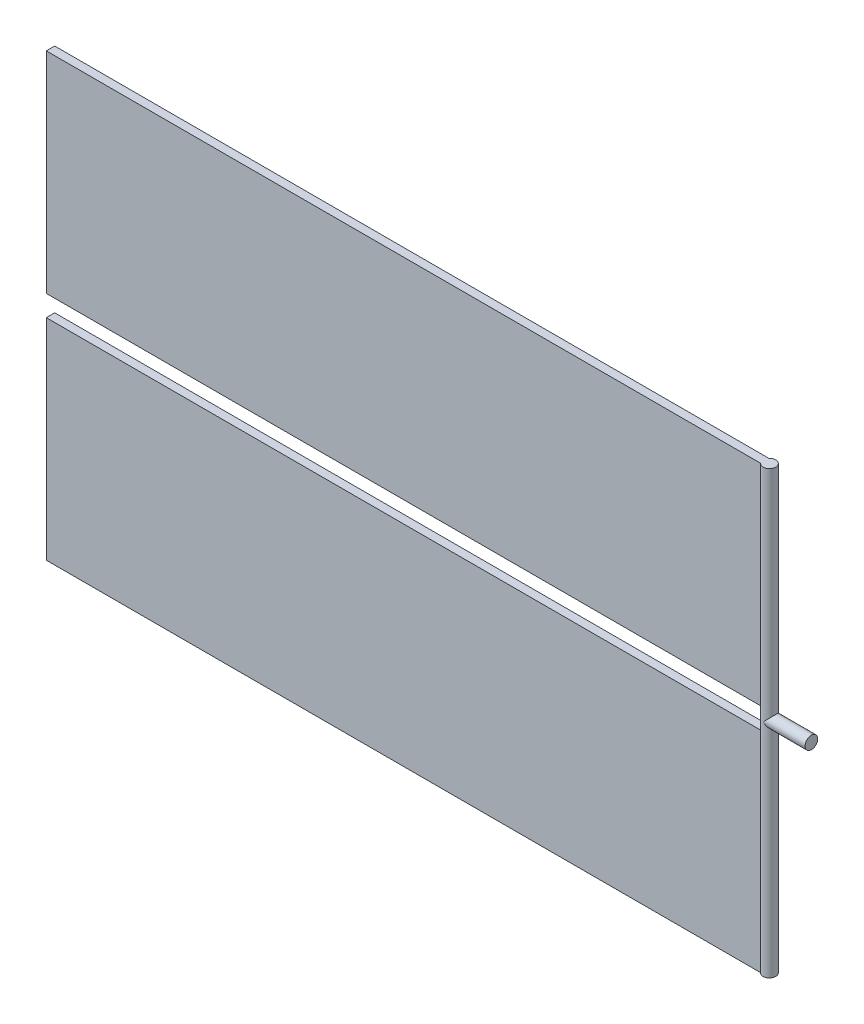
ISO-10303-21;
HEADER;
FILE_DESCRIPTION(('STEP AP214'),'2;1');
FILE_NAME('part.step','',(''),(''),'','','');
FILE_SCHEMA(('AUTOMOTIVE_DESIGN { 1 0 10303 214 1 1 1 1 }'));
ENDSEC;
DATA;
#1=APPLICATION_CONTEXT('core data for automotive mechanical design processes');
#2=APPLICATION_PROTOCOL_DEFINITION('international standard','automotive_design',2000,#1);
#3=PRODUCT_CONTEXT('',#1,'mechanical');
#4=PRODUCT('Part','Part','',(#3));
#5=PRODUCT_RELATED_PRODUCT_CATEGORY('part','',(#4));
#6=PRODUCT_DEFINITION_FORMATION('','',#4);
#7=PRODUCT_DEFINITION_CONTEXT('part definition',#1,'design');
#8=PRODUCT_DEFINITION('design','',#6,#7);
#9=PRODUCT_DEFINITION_SHAPE('','',#8);
#10=(LENGTH_UNIT() NAMED_UNIT(*) SI_UNIT(.MILLI.,.METRE.));
#11=(NAMED_UNIT(*) PLANE_ANGLE_UNIT() SI_UNIT($,.RADIAN.));
#12=(NAMED_UNIT(*) SI_UNIT($,.STERADIAN.) SOLID_ANGLE_UNIT());
#13=UNCERTAINTY_MEASURE_WITH_UNIT(LENGTH_MEASURE(1.E-05),#10,'distance_accuracy_value','');
#14=(GEOMETRIC_REPRESENTATION_CONTEXT(3) GLOBAL_UNCERTAINTY_ASSIGNED_CONTEXT((#13)) GLOBAL_UNIT_ASSIGNED_CONTEXT((#10,
#11,#12)) REPRESENTATION_CONTEXT('',''));
#15=CARTESIAN_POINT('',(0.,0.,0.));
#16=DIRECTION('',(0.,0.,1.));
#17=DIRECTION('',(1.,0.,0.));
#18=AXIS2_PLACEMENT_3D('',#15,#16,#17);
#19=CARTESIAN_POINT('',(111.80339887499,-5250.,0.));
#20=DIRECTION('',(0.,1.,0.));
#21=DIRECTION('',(0.,0.,1.));
#22=AXIS2_PLACEMENT_3D('',#19,#20,#21);
#23=CYLINDRICAL_SURFACE('',#22,150.);
#24=CARTESIAN_POINT('',(111.80339887499,0.,0.));
#25=DIRECTION('',(-0.707106781186547,0.707106781186547,0.));
#26=DIRECTION('',(0.707106781186547,0.707106781186547,0.));
#27=AXIS2_PLACEMENT_3D('',#24,#25,#26);
#28=ELLIPSE('',#27,212.132034355964,150.);
#29=CARTESIAN_POINT('',(111.80339887499,0.,150.));
#30=VERTEX_POINT('',#29);
#31=CARTESIAN_POINT('',(111.80339887499,0.,-150.));
#32=VERTEX_POINT('',#31);
#33=EDGE_CURVE('E11',#30,#32,#28,.T.);
#34=ORIENTED_EDGE('',*,*,#33,.T.);
#35=CARTESIAN_POINT('',(111.80339887499,0.,0.));
#36=DIRECTION('',(0.707106781186547,0.707106781186547,0.));
#37=DIRECTION('',(-0.707106781186547,0.707106781186547,0.));
#38=AXIS2_PLACEMENT_3D('',#35,#36,#37);
#39=ELLIPSE('',#38,212.132034355964,150.);
#40=EDGE_CURVE('E44',#32,#30,#39,.F.);
#41=ORIENTED_EDGE('',*,*,#40,.T.);
#42=EDGE_LOOP('',(#34,#41));
#43=FACE_BOUND('',#42,.T.);
#44=DIRECTION('',(0.,1.,0.));
#45=VECTOR('',#44,1.);
#46=CARTESIAN_POINT('',(7.31890940150233E-13,-5250.,-100.));
#47=LINE('',#46,#45);
#48=CARTESIAN_POINT('',(7.31890940150233E-13,-5250.,-100.));
#49=VERTEX_POINT('',#48);
#50=CARTESIAN_POINT('',(7.31890940150233E-13,-249.999999999997,-100.));
#51=VERTEX_POINT('',#50);
#52=EDGE_CURVE('E111',#49,#51,#47,.T.);
#53=ORIENTED_EDGE('',*,*,#52,.T.);
#54=CARTESIAN_POINT('',(7.31890940150233E-13,249.999999999998,-100.));
#55=VERTEX_POINT('',#54);
#56=EDGE_CURVE('E56',#51,#55,#47,.T.);
#57=ORIENTED_EDGE('',*,*,#56,.T.);
#58=DIRECTION('',(0.,1.,0.));
#59=VECTOR('',#58,1.);
#60=CARTESIAN_POINT('',(7.31890940150233E-13,250.,-100.));
#61=LINE('',#60,#59);
#62=CARTESIAN_POINT('',(7.31890940150233E-13,5250.,-100.));
#63=VERTEX_POINT('',#62);
#64=EDGE_CURVE('E168',#55,#63,#61,.T.);
#65=ORIENTED_EDGE('',*,*,#64,.T.);
#66=CARTESIAN_POINT('',(111.80339887499,5250.,0.));
#67=DIRECTION('',(0.,1.,0.));
#68=DIRECTION('',(0.,0.,1.));
#69=AXIS2_PLACEMENT_3D('',#66,#67,#68);
#70=CIRCLE('',#69,150.);
#71=CARTESIAN_POINT('',(7.31890940150233E-13,5250.,100.));
#72=VERTEX_POINT('',#71);
#73=EDGE_CURVE('E149',#72,#63,#70,.T.);
#74=ORIENTED_EDGE('',*,*,#73,.F.);
#75=DIRECTION('',(0.,1.,0.));
#76=VECTOR('',#75,1.);
#77=CARTESIAN_POINT('',(7.31890940150233E-13,250.,100.));
#78=LINE('',#77,#76);
#79=CARTESIAN_POINT('',(7.31890940150233E-13,249.999999999998,100.));
#80=VERTEX_POINT('',#79);
#81=EDGE_CURVE('E155',#80,#72,#78,.T.);
#82=ORIENTED_EDGE('',*,*,#81,.F.);
#83=DIRECTION('',(0.,1.,0.));
#84=VECTOR('',#83,1.);
#85=CARTESIAN_POINT('',(7.31890940150233E-13,-5250.,100.));
#86=LINE('',#85,#84);
#87=CARTESIAN_POINT('',(7.31890940150233E-13,-249.999999999997,100.));
#88=VERTEX_POINT('',#87);
#89=EDGE_CURVE('E119',#88,#80,#86,.T.);
#90=ORIENTED_EDGE('',*,*,#89,.F.);
#91=CARTESIAN_POINT('',(7.31890940150233E-13,-5250.,100.));
#92=VERTEX_POINT('',#91);
#93=EDGE_CURVE('E154',#92,#88,#86,.T.);
#94=ORIENTED_EDGE('',*,*,#93,.F.);
#95=CARTESIAN_POINT('',(111.80339887499,-5250.,0.));
#96=DIRECTION('',(0.,1.,0.));
#97=DIRECTION('',(0.,0.,1.));
#98=AXIS2_PLACEMENT_3D('',#95,#96,#97);
#99=CIRCLE('',#98,150.);
#100=EDGE_CURVE('E114',#92,#49,#99,.T.);
#101=ORIENTED_EDGE('',*,*,#100,.T.);
#102=EDGE_LOOP('',(#53,#57,#65,#74,#82,#90,#94,#101));
#103=FACE_BOUND('',#102,.T.);
#104=ADVANCED_FACE('F36',(#43,#103),#23,.T.);
#105=CARTESIAN_POINT('',(7.31890940150233E-13,250.,-100.));
#106=DIRECTION('',(0.,-1.,0.));
#107=DIRECTION('',(1.,0.,0.));
#108=AXIS2_PLACEMENT_3D('',#105,#106,#107);
#109=PLANE('',#108);
#110=DIRECTION('',(0.,0.,1.));
#111=VECTOR('',#110,1.);
#112=CARTESIAN_POINT('',(7.31890940150233E-13,250.,-100.));
#113=LINE('',#112,#111);
#114=EDGE_CURVE('E105',#55,#80,#113,.T.);
#115=ORIENTED_EDGE('',*,*,#114,.T.);
#116=DIRECTION('',(1.,0.,0.));
#117=VECTOR('',#116,1.);
#118=CARTESIAN_POINT('',(7.31890940150233E-13,250.,100.));
#119=LINE('',#118,#117);
#120=CARTESIAN_POINT('',(-17000.,249.999999999998,100.));
#121=VERTEX_POINT('',#120);
#122=EDGE_CURVE('E165',#121,#80,#119,.T.);
#123=ORIENTED_EDGE('',*,*,#122,.F.);
#124=DIRECTION('',(0.,0.,1.));
#125=VECTOR('',#124,1.);
#126=CARTESIAN_POINT('',(-17000.,249.999999999998,-100.));
#127=LINE('',#126,#125);
#128=CARTESIAN_POINT('',(-17000.,249.999999999998,-100.));
#129=VERTEX_POINT('',#128);
#130=EDGE_CURVE('E182',#129,#121,#127,.T.);
#131=ORIENTED_EDGE('',*,*,#130,.F.);
#132=DIRECTION('',(1.,0.,0.));
#133=VECTOR('',#132,1.);
#134=CARTESIAN_POINT('',(7.31890940150233E-13,250.,-100.));
#135=LINE('',#134,#133);
#136=EDGE_CURVE('E176',#129,#55,#135,.T.);
#137=ORIENTED_EDGE('',*,*,#136,.T.);
#138=EDGE_LOOP('',(#115,#123,#131,#137));
#139=FACE_BOUND('',#138,.T.);
#140=ADVANCED_FACE('F108',(#139),#109,.T.);
#141=CARTESIAN_POINT('',(-17000.,249.999999999998,-100.));
#142=DIRECTION('',(-1.,0.,0.));
#143=DIRECTION('',(0.,0.,1.));
#144=AXIS2_PLACEMENT_3D('',#141,#142,#143);
#145=PLANE('',#144);
#146=ORIENTED_EDGE('',*,*,#130,.T.);
#147=DIRECTION('',(0.,-1.,0.));
#148=VECTOR('',#147,1.);
#149=CARTESIAN_POINT('',(-17000.,249.999999999998,100.));
#150=LINE('',#149,#148);
#151=CARTESIAN_POINT('',(-17000.,5250.,100.));
#152=VERTEX_POINT('',#151);
#153=EDGE_CURVE('E162',#152,#121,#150,.T.);
#154=ORIENTED_EDGE('',*,*,#153,.F.);
#155=DIRECTION('',(0.,0.,1.));
#156=VECTOR('',#155,1.);
#157=CARTESIAN_POINT('',(-17000.,5250.,-100.));
#158=LINE('',#157,#156);
#159=CARTESIAN_POINT('',(-17000.,5250.,-100.));
#160=VERTEX_POINT('',#159);
#161=EDGE_CURVE('E179',#160,#152,#158,.T.);
#162=ORIENTED_EDGE('',*,*,#161,.F.);
#163=DIRECTION('',(0.,-1.,0.));
#164=VECTOR('',#163,1.);
#165=CARTESIAN_POINT('',(-17000.,249.999999999998,-100.));
#166=LINE('',#165,#164);
#167=EDGE_CURVE('E173',#160,#129,#166,.T.);
#168=ORIENTED_EDGE('',*,*,#167,.T.);
#169=EDGE_LOOP('',(#146,#154,#162,#168));
#170=FACE_BOUND('',#169,.T.);
#171=ADVANCED_FACE('F194',(#170),#145,.T.);
#172=CARTESIAN_POINT('',(7.31890940150233E-13,5250.,-100.));
#173=DIRECTION('',(0.,1.,0.));
#174=DIRECTION('',(-1.,0.,0.));
#175=AXIS2_PLACEMENT_3D('',#172,#173,#174);
#176=PLANE('',#175);
#177=ORIENTED_EDGE('',*,*,#161,.T.);
#178=DIRECTION('',(-1.,0.,0.));
#179=VECTOR('',#178,1.);
#180=CARTESIAN_POINT('',(7.31890940150233E-13,5250.,100.));
#181=LINE('',#180,#179);
#182=EDGE_CURVE('E159',#72,#152,#181,.T.);
#183=ORIENTED_EDGE('',*,*,#182,.F.);
#184=ORIENTED_EDGE('',*,*,#73,.T.);
#185=DIRECTION('',(-1.,0.,0.));
#186=VECTOR('',#185,1.);
#187=CARTESIAN_POINT('',(7.31890940150233E-13,5250.,-100.));
#188=LINE('',#187,#186);
#189=EDGE_CURVE('E170',#63,#160,#188,.T.);
#190=ORIENTED_EDGE('',*,*,#189,.T.);
#191=EDGE_LOOP('',(#177,#183,#184,#190));
#192=FACE_BOUND('',#191,.T.);
#193=ADVANCED_FACE('F38',(#192),#176,.T.);
#194=CARTESIAN_POINT('',(0.,0.,-100.));
#195=DIRECTION('',(0.,0.,1.));
#196=DIRECTION('',(1.,0.,0.));
#197=AXIS2_PLACEMENT_3D('',#194,#195,#196);
#198=PLANE('',#197);
#199=ORIENTED_EDGE('',*,*,#64,.F.);
#200=ORIENTED_EDGE('',*,*,#136,.F.);
#201=ORIENTED_EDGE('',*,*,#167,.F.);
#202=ORIENTED_EDGE('',*,*,#189,.F.);
#203=EDGE_LOOP('',(#199,#200,#201,#202));
#204=FACE_BOUND('',#203,.T.);
#205=ADVANCED_FACE('F200',(#204),#198,.F.);
#206=CARTESIAN_POINT('',(0.,0.,100.));
#207=DIRECTION('',(0.,0.,1.));
#208=DIRECTION('',(1.,0.,0.));
#209=AXIS2_PLACEMENT_3D('',#206,#207,#208);
#210=PLANE('',#209);
#211=ORIENTED_EDGE('',*,*,#81,.T.);
#212=ORIENTED_EDGE('',*,*,#182,.T.);
#213=ORIENTED_EDGE('',*,*,#153,.T.);
#214=ORIENTED_EDGE('',*,*,#122,.T.);
#215=EDGE_LOOP('',(#211,#212,#213,#214));
#216=FACE_BOUND('',#215,.T.);
#217=ADVANCED_FACE('F191',(#216),#210,.T.);
#218=CARTESIAN_POINT('',(7.31890940150233E-13,-5250.,-100.));
#219=DIRECTION('',(-1.,0.,0.));
#220=DIRECTION('',(0.,0.,1.));
#221=AXIS2_PLACEMENT_3D('',#218,#219,#220);
#222=PLANE('',#221);
#223=DIRECTION('',(0.,0.,1.));
#224=VECTOR('',#223,1.);
#225=CARTESIAN_POINT('',(7.31890940150233E-13,-250.,-100.));
#226=LINE('',#225,#224);
#227=EDGE_CURVE('E124',#51,#88,#226,.T.);
#228=ORIENTED_EDGE('',*,*,#227,.T.);
#229=ORIENTED_EDGE('',*,*,#89,.T.);
#230=ORIENTED_EDGE('',*,*,#114,.F.);
#231=ORIENTED_EDGE('',*,*,#56,.F.);
#232=EDGE_LOOP('',(#228,#229,#230,#231));
#233=FACE_BOUND('',#232,.T.);
#234=ADVANCED_FACE('F198',(#233),#222,.T.);
#235=CARTESIAN_POINT('',(111.80339887499,-5250.,0.));
#236=DIRECTION('',(0.,1.,0.));
#237=DIRECTION('',(0.,0.,1.));
#238=AXIS2_PLACEMENT_3D('',#235,#236,#237);
#239=PLANE('',#238);
#240=ORIENTED_EDGE('',*,*,#100,.F.);
#241=DIRECTION('',(1.,0.,0.));
#242=VECTOR('',#241,1.);
#243=CARTESIAN_POINT('',(7.31890940150233E-13,-5250.,100.));
#244=LINE('',#243,#242);
#245=CARTESIAN_POINT('',(-17000.,-5250.,100.));
#246=VERTEX_POINT('',#245);
#247=EDGE_CURVE('E138',#246,#92,#244,.T.);
#248=ORIENTED_EDGE('',*,*,#247,.F.);
#249=DIRECTION('',(0.,0.,1.));
#250=VECTOR('',#249,1.);
#251=CARTESIAN_POINT('',(-17000.,-5250.,-100.));
#252=LINE('',#251,#250);
#253=CARTESIAN_POINT('',(-17000.,-5250.,-100.));
#254=VERTEX_POINT('',#253);
#255=EDGE_CURVE('E147',#254,#246,#252,.T.);
#256=ORIENTED_EDGE('',*,*,#255,.F.);
#257=DIRECTION('',(1.,0.,0.));
#258=VECTOR('',#257,1.);
#259=CARTESIAN_POINT('',(7.31890940150233E-13,-5250.,-100.));
#260=LINE('',#259,#258);
#261=EDGE_CURVE('E132',#254,#49,#260,.T.);
#262=ORIENTED_EDGE('',*,*,#261,.T.);
#263=EDGE_LOOP('',(#240,#248,#256,#262));
#264=FACE_BOUND('',#263,.T.);
#265=ADVANCED_FACE('F207',(#264),#239,.F.);
#266=CARTESIAN_POINT('',(-17000.,-249.999999999998,-100.));
#267=DIRECTION('',(-1.,0.,0.));
#268=DIRECTION('',(0.,0.,1.));
#269=AXIS2_PLACEMENT_3D('',#266,#267,#268);
#270=PLANE('',#269);
#271=ORIENTED_EDGE('',*,*,#255,.T.);
#272=DIRECTION('',(0.,-1.,0.));
#273=VECTOR('',#272,1.);
#274=CARTESIAN_POINT('',(-17000.,-249.999999999998,100.));
#275=LINE('',#274,#273);
#276=CARTESIAN_POINT('',(-17000.,-249.999999999998,100.));
#277=VERTEX_POINT('',#276);
#278=EDGE_CURVE('E142',#277,#246,#275,.T.);
#279=ORIENTED_EDGE('',*,*,#278,.F.);
#280=DIRECTION('',(0.,0.,1.));
#281=VECTOR('',#280,1.);
#282=CARTESIAN_POINT('',(-17000.,-249.999999999998,-100.));
#283=LINE('',#282,#281);
#284=CARTESIAN_POINT('',(-17000.,-249.999999999998,-100.));
#285=VERTEX_POINT('',#284);
#286=EDGE_CURVE('E131',#285,#277,#283,.T.);
#287=ORIENTED_EDGE('',*,*,#286,.F.);
#288=DIRECTION('',(0.,-1.,0.));
#289=VECTOR('',#288,1.);
#290=CARTESIAN_POINT('',(-17000.,-249.999999999998,-100.));
#291=LINE('',#290,#289);
#292=EDGE_CURVE('E137',#285,#254,#291,.T.);
#293=ORIENTED_EDGE('',*,*,#292,.T.);
#294=EDGE_LOOP('',(#271,#279,#287,#293));
#295=FACE_BOUND('',#294,.T.);
#296=ADVANCED_FACE('F209',(#295),#270,.T.);
#297=CARTESIAN_POINT('',(7.31890940150233E-13,-250.,-100.));
#298=DIRECTION('',(0.,1.,0.));
#299=DIRECTION('',(-1.,0.,0.));
#300=AXIS2_PLACEMENT_3D('',#297,#298,#299);
#301=PLANE('',#300);
#302=ORIENTED_EDGE('',*,*,#286,.T.);
#303=DIRECTION('',(-1.,0.,0.));
#304=VECTOR('',#303,1.);
#305=CARTESIAN_POINT('',(7.31890940150233E-13,-250.,100.));
#306=LINE('',#305,#304);
#307=EDGE_CURVE('E128',#88,#277,#306,.T.);
#308=ORIENTED_EDGE('',*,*,#307,.F.);
#309=ORIENTED_EDGE('',*,*,#227,.F.);
#310=DIRECTION('',(-1.,0.,0.));
#311=VECTOR('',#310,1.);
#312=CARTESIAN_POINT('',(7.31890940150233E-13,-250.,-100.));
#313=LINE('',#312,#311);
#314=EDGE_CURVE('E126',#51,#285,#313,.T.);
#315=ORIENTED_EDGE('',*,*,#314,.T.);
#316=EDGE_LOOP('',(#302,#308,#309,#315));
#317=FACE_BOUND('',#316,.T.);
#318=ADVANCED_FACE('F125',(#317),#301,.T.);
#319=CARTESIAN_POINT('',(0.,0.,-100.));
#320=DIRECTION('',(0.,0.,-1.));
#321=DIRECTION('',(-1.,0.,0.));
#322=AXIS2_PLACEMENT_3D('',#319,#320,#321);
#323=PLANE('',#322);
#324=ORIENTED_EDGE('',*,*,#52,.F.);
#325=ORIENTED_EDGE('',*,*,#261,.F.);
#326=ORIENTED_EDGE('',*,*,#292,.F.);
#327=ORIENTED_EDGE('',*,*,#314,.F.);
#328=EDGE_LOOP('',(#324,#325,#326,#327));
#329=FACE_BOUND('',#328,.T.);
#330=ADVANCED_FACE('F135',(#329),#323,.T.);
#331=CARTESIAN_POINT('',(0.,0.,100.));
#332=DIRECTION('',(0.,0.,-1.));
#333=DIRECTION('',(-1.,0.,0.));
#334=AXIS2_PLACEMENT_3D('',#331,#332,#333);
#335=PLANE('',#334);
#336=ORIENTED_EDGE('',*,*,#93,.T.);
#337=ORIENTED_EDGE('',*,*,#307,.T.);
#338=ORIENTED_EDGE('',*,*,#278,.T.);
#339=ORIENTED_EDGE('',*,*,#247,.T.);
#340=EDGE_LOOP('',(#336,#337,#338,#339));
#341=FACE_BOUND('',#340,.T.);
#342=ADVANCED_FACE('F204',(#341),#335,.F.);
#343=CARTESIAN_POINT('',(1111.76,0.,0.));
#344=DIRECTION('',(-1.,0.,0.));
#345=DIRECTION('',(0.,0.,1.));
#346=AXIS2_PLACEMENT_3D('',#343,#344,#345);
#347=CYLINDRICAL_SURFACE('',#346,150.);
#348=ORIENTED_EDGE('',*,*,#33,.F.);
#349=ORIENTED_EDGE('',*,*,#40,.F.);
#350=EDGE_LOOP('',(#348,#349));
#351=FACE_BOUND('',#350,.T.);
#352=CARTESIAN_POINT('',(1111.76,0.,0.));
#353=DIRECTION('',(1.,0.,0.));
#354=DIRECTION('',(0.,0.,-1.));
#355=AXIS2_PLACEMENT_3D('',#352,#353,#354);
#356=CIRCLE('',#355,150.);
#357=CARTESIAN_POINT('',(1111.76,0.,-150.));
#358=VERTEX_POINT('',#357);
#359=EDGE_CURVE('E210',#358,#358,#356,.T.);
#360=ORIENTED_EDGE('',*,*,#359,.F.);
#361=EDGE_LOOP('',(#360));
#362=FACE_BOUND('',#361,.T.);
#363=ADVANCED_FACE('F102',(#351,#362),#347,.T.);
#364=CARTESIAN_POINT('',(1111.76,0.,0.));
#365=DIRECTION('',(1.,0.,0.));
#366=DIRECTION('',(0.,0.,-1.));
#367=AXIS2_PLACEMENT_3D('',#364,#365,#366);
#368=PLANE('',#367);
#369=ORIENTED_EDGE('',*,*,#359,.T.);
#370=EDGE_LOOP('',(#369));
#371=FACE_BOUND('',#370,.T.);
#372=ADVANCED_FACE('F216',(#371),#368,.T.);
#373=CLOSED_SHELL('',(#104,#140,#171,#193,#205,#217,#234,#265,#296,#318,#330,#342,#363,#372));
#374=MANIFOLD_SOLID_BREP('B2',#373);
#375=ADVANCED_BREP_SHAPE_REPRESENTATION('',(#18,#374),#14);
#376=SHAPE_DEFINITION_REPRESENTATION(#9,#375);
ENDSEC;
END-ISO-10303-21;
